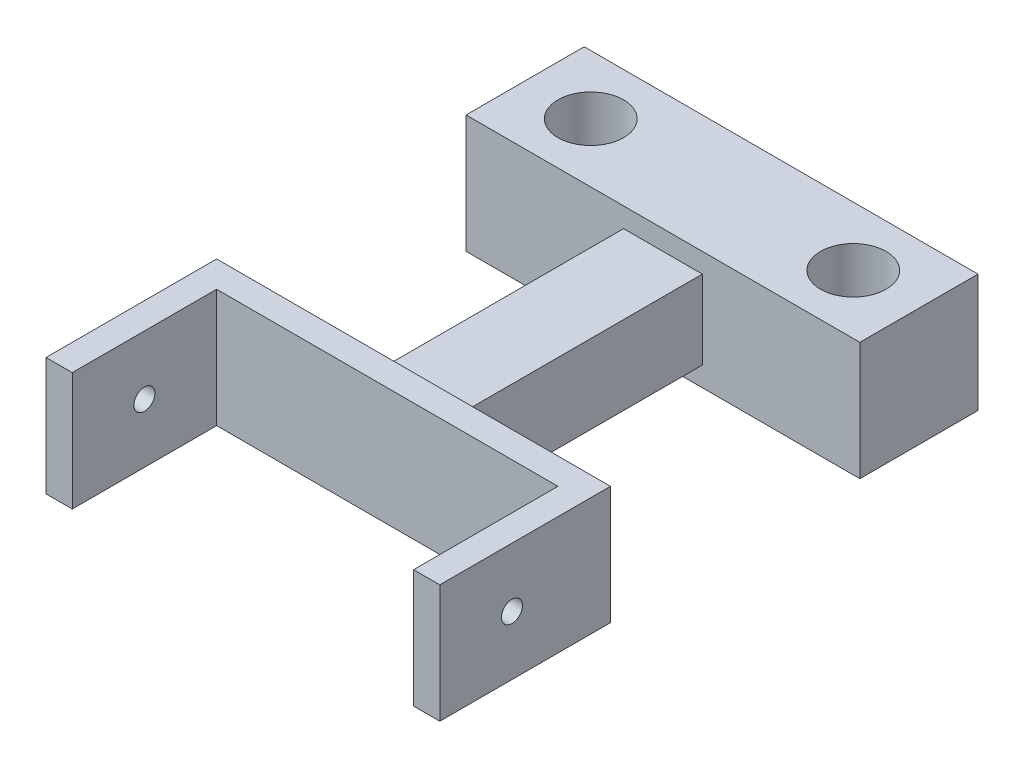
ISO-10303-21;
HEADER;
FILE_DESCRIPTION(('STEP AP214'),'2;1');
FILE_NAME('part.step','',(''),(''),'','','');
FILE_SCHEMA(('AUTOMOTIVE_DESIGN { 1 0 10303 214 1 1 1 1 }'));
ENDSEC;
DATA;
#1=APPLICATION_CONTEXT('core data for automotive mechanical design processes');
#2=APPLICATION_PROTOCOL_DEFINITION('international standard','automotive_design',2000,#1);
#3=PRODUCT_CONTEXT('',#1,'mechanical');
#4=PRODUCT('Part','Part','',(#3));
#5=PRODUCT_RELATED_PRODUCT_CATEGORY('part','',(#4));
#6=PRODUCT_DEFINITION_FORMATION('','',#4);
#7=PRODUCT_DEFINITION_CONTEXT('part definition',#1,'design');
#8=PRODUCT_DEFINITION('design','',#6,#7);
#9=PRODUCT_DEFINITION_SHAPE('','',#8);
#10=(LENGTH_UNIT() NAMED_UNIT(*) SI_UNIT(.MILLI.,.METRE.));
#11=(NAMED_UNIT(*) PLANE_ANGLE_UNIT() SI_UNIT($,.RADIAN.));
#12=(NAMED_UNIT(*) SI_UNIT($,.STERADIAN.) SOLID_ANGLE_UNIT());
#13=UNCERTAINTY_MEASURE_WITH_UNIT(LENGTH_MEASURE(1.E-05),#10,'distance_accuracy_value','');
#14=(GEOMETRIC_REPRESENTATION_CONTEXT(3) GLOBAL_UNCERTAINTY_ASSIGNED_CONTEXT((#13)) GLOBAL_UNIT_ASSIGNED_CONTEXT((#10,
#11,#12)) REPRESENTATION_CONTEXT('',''));
#15=CARTESIAN_POINT('',(0.,0.,0.));
#16=DIRECTION('',(0.,0.,1.));
#17=DIRECTION('',(1.,0.,0.));
#18=AXIS2_PLACEMENT_3D('',#15,#16,#17);
#19=CARTESIAN_POINT('',(75.,22.5,-45.));
#20=DIRECTION('',(1.,0.,0.));
#21=DIRECTION('',(0.,0.,-1.));
#22=AXIS2_PLACEMENT_3D('',#19,#20,#21);
#23=PLANE('',#22);
#24=DIRECTION('',(0.,1.,0.));
#25=VECTOR('',#24,1.);
#26=CARTESIAN_POINT('',(75.,22.5,0.));
#27=LINE('',#26,#25);
#28=CARTESIAN_POINT('',(75.,-22.5,0.));
#29=VERTEX_POINT('',#28);
#30=CARTESIAN_POINT('',(75.,22.5,0.));
#31=VERTEX_POINT('',#30);
#32=EDGE_CURVE('E221',#29,#31,#27,.T.);
#33=ORIENTED_EDGE('',*,*,#32,.F.);
#34=DIRECTION('',(0.,0.,1.));
#35=VECTOR('',#34,1.);
#36=CARTESIAN_POINT('',(75.,-22.5,-45.));
#37=LINE('',#36,#35);
#38=CARTESIAN_POINT('',(75.,-22.5,-45.));
#39=VERTEX_POINT('',#38);
#40=EDGE_CURVE('E11',#39,#29,#37,.T.);
#41=ORIENTED_EDGE('',*,*,#40,.F.);
#42=DIRECTION('',(0.,1.,0.));
#43=VECTOR('',#42,1.);
#44=CARTESIAN_POINT('',(75.,22.5,-45.));
#45=LINE('',#44,#43);
#46=CARTESIAN_POINT('',(75.,22.5,-45.));
#47=VERTEX_POINT('',#46);
#48=EDGE_CURVE('E226',#39,#47,#45,.T.);
#49=ORIENTED_EDGE('',*,*,#48,.T.);
#50=DIRECTION('',(0.,0.,1.));
#51=VECTOR('',#50,1.);
#52=CARTESIAN_POINT('',(75.,22.5,-45.));
#53=LINE('',#52,#51);
#54=EDGE_CURVE('E44',#47,#31,#53,.T.);
#55=ORIENTED_EDGE('',*,*,#54,.T.);
#56=EDGE_LOOP('',(#33,#41,#49,#55));
#57=FACE_BOUND('',#56,.T.);
#58=ADVANCED_FACE('F41',(#57),#23,.T.);
#59=CARTESIAN_POINT('',(-75.,-22.5,-45.));
#60=DIRECTION('',(0.,-1.,0.));
#61=DIRECTION('',(0.,0.,-1.));
#62=AXIS2_PLACEMENT_3D('',#59,#60,#61);
#63=PLANE('',#62);
#64=CARTESIAN_POINT('',(-50.,-22.5,-22.5));
#65=DIRECTION('',(0.,1.,0.));
#66=DIRECTION('',(0.,0.,1.));
#67=AXIS2_PLACEMENT_3D('',#64,#65,#66);
#68=CIRCLE('',#67,12.5);
#69=CARTESIAN_POINT('',(-50.,-22.5,-9.99999999999999));
#70=VERTEX_POINT('',#69);
#71=EDGE_CURVE('E217',#70,#70,#68,.T.);
#72=ORIENTED_EDGE('',*,*,#71,.T.);
#73=EDGE_LOOP('',(#72));
#74=FACE_BOUND('',#73,.T.);
#75=CARTESIAN_POINT('',(50.,-22.5,-22.5));
#76=DIRECTION('',(0.,1.,0.));
#77=DIRECTION('',(0.,0.,1.));
#78=AXIS2_PLACEMENT_3D('',#75,#76,#77);
#79=CIRCLE('',#78,12.5);
#80=CARTESIAN_POINT('',(50.,-22.5,-10.));
#81=VERTEX_POINT('',#80);
#82=EDGE_CURVE('E213',#81,#81,#79,.T.);
#83=ORIENTED_EDGE('',*,*,#82,.T.);
#84=EDGE_LOOP('',(#83));
#85=FACE_BOUND('',#84,.T.);
#86=DIRECTION('',(1.,0.,0.));
#87=VECTOR('',#86,1.);
#88=CARTESIAN_POINT('',(-75.,-22.5,0.));
#89=LINE('',#88,#87);
#90=CARTESIAN_POINT('',(-75.,-22.5,0.));
#91=VERTEX_POINT('',#90);
#92=EDGE_CURVE('E230',#91,#29,#89,.T.);
#93=ORIENTED_EDGE('',*,*,#92,.F.);
#94=DIRECTION('',(0.,0.,1.));
#95=VECTOR('',#94,1.);
#96=CARTESIAN_POINT('',(-75.,-22.5,-45.));
#97=LINE('',#96,#95);
#98=CARTESIAN_POINT('',(-75.,-22.5,-45.));
#99=VERTEX_POINT('',#98);
#100=EDGE_CURVE('E49',#99,#91,#97,.T.);
#101=ORIENTED_EDGE('',*,*,#100,.F.);
#102=DIRECTION('',(1.,0.,0.));
#103=VECTOR('',#102,1.);
#104=CARTESIAN_POINT('',(-75.,-22.5,-45.));
#105=LINE('',#104,#103);
#106=EDGE_CURVE('E236',#99,#39,#105,.T.);
#107=ORIENTED_EDGE('',*,*,#106,.T.);
#108=ORIENTED_EDGE('',*,*,#40,.T.);
#109=EDGE_LOOP('',(#93,#101,#107,#108));
#110=FACE_BOUND('',#109,.T.);
#111=ADVANCED_FACE('F262',(#74,#85,#110),#63,.T.);
#112=CARTESIAN_POINT('',(-75.,22.5,-45.));
#113=DIRECTION('',(-1.,0.,0.));
#114=DIRECTION('',(0.,0.,1.));
#115=AXIS2_PLACEMENT_3D('',#112,#113,#114);
#116=PLANE('',#115);
#117=DIRECTION('',(0.,-1.,0.));
#118=VECTOR('',#117,1.);
#119=CARTESIAN_POINT('',(-75.,22.5,0.));
#120=LINE('',#119,#118);
#121=CARTESIAN_POINT('',(-75.,22.5,0.));
#122=VERTEX_POINT('',#121);
#123=EDGE_CURVE('E244',#122,#91,#120,.T.);
#124=ORIENTED_EDGE('',*,*,#123,.F.);
#125=DIRECTION('',(0.,0.,1.));
#126=VECTOR('',#125,1.);
#127=CARTESIAN_POINT('',(-75.,22.5,-45.));
#128=LINE('',#127,#126);
#129=CARTESIAN_POINT('',(-75.,22.5,-45.));
#130=VERTEX_POINT('',#129);
#131=EDGE_CURVE('E249',#130,#122,#128,.T.);
#132=ORIENTED_EDGE('',*,*,#131,.F.);
#133=DIRECTION('',(0.,-1.,0.));
#134=VECTOR('',#133,1.);
#135=CARTESIAN_POINT('',(-75.,22.5,-45.));
#136=LINE('',#135,#134);
#137=EDGE_CURVE('E233',#130,#99,#136,.T.);
#138=ORIENTED_EDGE('',*,*,#137,.T.);
#139=ORIENTED_EDGE('',*,*,#100,.T.);
#140=EDGE_LOOP('',(#124,#132,#138,#139));
#141=FACE_BOUND('',#140,.T.);
#142=ADVANCED_FACE('F268',(#141),#116,.T.);
#143=CARTESIAN_POINT('',(-75.,22.5,-45.));
#144=DIRECTION('',(0.,1.,0.));
#145=DIRECTION('',(0.,0.,1.));
#146=AXIS2_PLACEMENT_3D('',#143,#144,#145);
#147=PLANE('',#146);
#148=CARTESIAN_POINT('',(-50.,22.5,-22.5));
#149=DIRECTION('',(0.,1.,0.));
#150=DIRECTION('',(0.,0.,1.));
#151=AXIS2_PLACEMENT_3D('',#148,#149,#150);
#152=CIRCLE('',#151,12.5);
#153=CARTESIAN_POINT('',(-50.,22.5,-9.99999999999999));
#154=VERTEX_POINT('',#153);
#155=EDGE_CURVE('E214',#154,#154,#152,.T.);
#156=ORIENTED_EDGE('',*,*,#155,.F.);
#157=EDGE_LOOP('',(#156));
#158=FACE_BOUND('',#157,.T.);
#159=CARTESIAN_POINT('',(50.,22.5,-22.5));
#160=DIRECTION('',(0.,1.,0.));
#161=DIRECTION('',(0.,0.,1.));
#162=AXIS2_PLACEMENT_3D('',#159,#160,#161);
#163=CIRCLE('',#162,12.5);
#164=CARTESIAN_POINT('',(50.,22.5,-10.));
#165=VERTEX_POINT('',#164);
#166=EDGE_CURVE('E218',#165,#165,#163,.T.);
#167=ORIENTED_EDGE('',*,*,#166,.F.);
#168=EDGE_LOOP('',(#167));
#169=FACE_BOUND('',#168,.T.);
#170=DIRECTION('',(-1.,0.,0.));
#171=VECTOR('',#170,1.);
#172=CARTESIAN_POINT('',(-75.,22.5,0.));
#173=LINE('',#172,#171);
#174=EDGE_CURVE('E241',#31,#122,#173,.T.);
#175=ORIENTED_EDGE('',*,*,#174,.F.);
#176=ORIENTED_EDGE('',*,*,#54,.F.);
#177=DIRECTION('',(-1.,0.,0.));
#178=VECTOR('',#177,1.);
#179=CARTESIAN_POINT('',(-75.,22.5,-45.));
#180=LINE('',#179,#178);
#181=EDGE_CURVE('E229',#47,#130,#180,.T.);
#182=ORIENTED_EDGE('',*,*,#181,.T.);
#183=ORIENTED_EDGE('',*,*,#131,.T.);
#184=EDGE_LOOP('',(#175,#176,#182,#183));
#185=FACE_BOUND('',#184,.T.);
#186=ADVANCED_FACE('F257',(#158,#169,#185),#147,.T.);
#187=CARTESIAN_POINT('',(0.,0.,-45.));
#188=DIRECTION('',(0.,0.,1.));
#189=DIRECTION('',(1.,0.,0.));
#190=AXIS2_PLACEMENT_3D('',#187,#188,#189);
#191=PLANE('',#190);
#192=ORIENTED_EDGE('',*,*,#48,.F.);
#193=ORIENTED_EDGE('',*,*,#106,.F.);
#194=ORIENTED_EDGE('',*,*,#137,.F.);
#195=ORIENTED_EDGE('',*,*,#181,.F.);
#196=EDGE_LOOP('',(#192,#193,#194,#195));
#197=FACE_BOUND('',#196,.T.);
#198=ADVANCED_FACE('F265',(#197),#191,.F.);
#199=CARTESIAN_POINT('',(0.,0.,0.));
#200=DIRECTION('',(0.,0.,1.));
#201=DIRECTION('',(1.,0.,0.));
#202=AXIS2_PLACEMENT_3D('',#199,#200,#201);
#203=PLANE('',#202);
#204=DIRECTION('',(0.,1.,0.));
#205=VECTOR('',#204,1.);
#206=CARTESIAN_POINT('',(15.,15.,0.));
#207=LINE('',#206,#205);
#208=CARTESIAN_POINT('',(15.,-15.,0.));
#209=VERTEX_POINT('',#208);
#210=CARTESIAN_POINT('',(15.,15.,0.));
#211=VERTEX_POINT('',#210);
#212=EDGE_CURVE('E57',#209,#211,#207,.T.);
#213=ORIENTED_EDGE('',*,*,#212,.F.);
#214=DIRECTION('',(1.,0.,0.));
#215=VECTOR('',#214,1.);
#216=CARTESIAN_POINT('',(-15.,-15.,0.));
#217=LINE('',#216,#215);
#218=CARTESIAN_POINT('',(-15.,-15.,0.));
#219=VERTEX_POINT('',#218);
#220=EDGE_CURVE('E61',#219,#209,#217,.T.);
#221=ORIENTED_EDGE('',*,*,#220,.F.);
#222=DIRECTION('',(0.,-1.,0.));
#223=VECTOR('',#222,1.);
#224=CARTESIAN_POINT('',(-15.,15.,0.));
#225=LINE('',#224,#223);
#226=CARTESIAN_POINT('',(-15.,15.,0.));
#227=VERTEX_POINT('',#226);
#228=EDGE_CURVE('E199',#227,#219,#225,.T.);
#229=ORIENTED_EDGE('',*,*,#228,.F.);
#230=DIRECTION('',(-1.,0.,0.));
#231=VECTOR('',#230,1.);
#232=CARTESIAN_POINT('',(-15.,15.,0.));
#233=LINE('',#232,#231);
#234=EDGE_CURVE('E178',#211,#227,#233,.T.);
#235=ORIENTED_EDGE('',*,*,#234,.F.);
#236=EDGE_LOOP('',(#213,#221,#229,#235));
#237=FACE_BOUND('',#236,.T.);
#238=ORIENTED_EDGE('',*,*,#32,.T.);
#239=ORIENTED_EDGE('',*,*,#174,.T.);
#240=ORIENTED_EDGE('',*,*,#123,.T.);
#241=ORIENTED_EDGE('',*,*,#92,.T.);
#242=EDGE_LOOP('',(#238,#239,#240,#241));
#243=FACE_BOUND('',#242,.T.);
#244=ADVANCED_FACE('F259',(#237,#243),#203,.T.);
#245=CARTESIAN_POINT('',(50.,-22.5,-22.5));
#246=DIRECTION('',(0.,1.,0.));
#247=DIRECTION('',(0.,0.,1.));
#248=AXIS2_PLACEMENT_3D('',#245,#246,#247);
#249=CYLINDRICAL_SURFACE('',#248,12.5);
#250=CARTESIAN_POINT('',(50.,-22.5,-10.));
#251=CARTESIAN_POINT('',(50.,-22.03125,-10.));
#252=CARTESIAN_POINT('',(50.,-21.5625,-10.));
#253=CARTESIAN_POINT('',(50.,-20.625,-10.));
#254=CARTESIAN_POINT('',(50.,-20.15625,-10.));
#255=CARTESIAN_POINT('',(50.,-19.21875,-10.));
#256=CARTESIAN_POINT('',(50.,-18.75,-10.));
#257=CARTESIAN_POINT('',(50.,-17.8125,-10.));
#258=CARTESIAN_POINT('',(50.,-17.34375,-10.));
#259=CARTESIAN_POINT('',(50.,-16.40625,-10.));
#260=CARTESIAN_POINT('',(50.,-15.9375,-10.));
#261=CARTESIAN_POINT('',(50.,-15.,-10.));
#262=CARTESIAN_POINT('',(50.,-14.53125,-10.));
#263=CARTESIAN_POINT('',(50.,-13.59375,-10.));
#264=CARTESIAN_POINT('',(50.,-13.125,-10.));
#265=CARTESIAN_POINT('',(50.,-12.1875,-10.));
#266=CARTESIAN_POINT('',(50.,-11.71875,-10.));
#267=CARTESIAN_POINT('',(50.,-10.78125,-10.));
#268=CARTESIAN_POINT('',(50.,-10.3125,-10.));
#269=CARTESIAN_POINT('',(50.,-9.375,-10.));
#270=CARTESIAN_POINT('',(50.,-8.90625,-10.));
#271=CARTESIAN_POINT('',(50.,-7.96875,-10.));
#272=CARTESIAN_POINT('',(50.,-7.5,-10.));
#273=CARTESIAN_POINT('',(50.,-6.5625,-10.));
#274=CARTESIAN_POINT('',(50.,-6.09375,-10.));
#275=CARTESIAN_POINT('',(50.,-5.15625,-10.));
#276=CARTESIAN_POINT('',(50.,-4.6875,-10.));
#277=CARTESIAN_POINT('',(50.,-3.75,-10.));
#278=CARTESIAN_POINT('',(50.,-3.28125,-10.));
#279=CARTESIAN_POINT('',(50.,-2.34375,-10.));
#280=CARTESIAN_POINT('',(50.,-1.875,-10.));
#281=CARTESIAN_POINT('',(50.,-0.937500000000001,-10.));
#282=CARTESIAN_POINT('',(50.,-0.46875,-10.));
#283=CARTESIAN_POINT('',(50.,0.46875,-10.));
#284=CARTESIAN_POINT('',(50.,0.937500000000001,-10.));
#285=CARTESIAN_POINT('',(50.,1.875,-10.));
#286=CARTESIAN_POINT('',(50.,2.34375,-10.));
#287=CARTESIAN_POINT('',(50.,3.28125,-10.));
#288=CARTESIAN_POINT('',(50.,3.75,-10.));
#289=CARTESIAN_POINT('',(50.,4.6875,-10.));
#290=CARTESIAN_POINT('',(50.,5.15625,-10.));
#291=CARTESIAN_POINT('',(50.,6.09375,-10.));
#292=CARTESIAN_POINT('',(50.,6.5625,-10.));
#293=CARTESIAN_POINT('',(50.,7.5,-10.));
#294=CARTESIAN_POINT('',(50.,7.96875,-10.));
#295=CARTESIAN_POINT('',(50.,8.90625,-10.));
#296=CARTESIAN_POINT('',(50.,9.375,-10.));
#297=CARTESIAN_POINT('',(50.,10.3125,-10.));
#298=CARTESIAN_POINT('',(50.,10.78125,-10.));
#299=CARTESIAN_POINT('',(50.,11.71875,-10.));
#300=CARTESIAN_POINT('',(50.,12.1875,-10.));
#301=CARTESIAN_POINT('',(50.,13.125,-10.));
#302=CARTESIAN_POINT('',(50.,13.59375,-10.));
#303=CARTESIAN_POINT('',(50.,14.53125,-10.));
#304=CARTESIAN_POINT('',(50.,15.,-10.));
#305=CARTESIAN_POINT('',(50.,15.9375,-10.));
#306=CARTESIAN_POINT('',(50.,16.40625,-10.));
#307=CARTESIAN_POINT('',(50.,17.34375,-10.));
#308=CARTESIAN_POINT('',(50.,17.8125,-10.));
#309=CARTESIAN_POINT('',(50.,18.75,-10.));
#310=CARTESIAN_POINT('',(50.,19.21875,-10.));
#311=CARTESIAN_POINT('',(50.,20.15625,-10.));
#312=CARTESIAN_POINT('',(50.,20.625,-10.));
#313=CARTESIAN_POINT('',(50.,21.5625,-10.));
#314=CARTESIAN_POINT('',(50.,22.03125,-10.));
#315=CARTESIAN_POINT('',(50.,22.5,-10.));
#316=B_SPLINE_CURVE_WITH_KNOTS('',3,(#250,#251,#252,#253,#254,#255,#256,#257,#258,#259,#260,
#261,#262,#263,#264,#265,#266,#267,#268,#269,#270,#271,#272,#273,#274,#275,#276,#277,#278,#279,
#280,#281,#282,#283,#284,#285,#286,#287,#288,#289,#290,#291,#292,#293,#294,#295,#296,#297,#298,
#299,#300,#301,#302,#303,#304,#305,#306,#307,#308,#309,#310,#311,#312,#313,#314,#315),
.UNSPECIFIED.,.F.,.F.,(4,2,2,2,2,2,2,2,2,2,2,2,2,2,2,2,2,2,2,2,2,2,2,2,2,2,2,2,2,2,2,2,4),(0.,
1.40625,2.8125,4.21875,5.625,7.03125,8.4375,9.84375,11.25,12.65625,14.0625,15.46875,16.875,
18.28125,19.6875,21.09375,22.5,23.90625,25.3125,26.71875,28.125,29.53125,30.9375,32.34375,33.75,
35.15625,36.5625,37.96875,39.375,40.78125,42.1875,43.59375,45.),.UNSPECIFIED.);
#317=EDGE_CURVE('BSEAM316',#81,#165,#316,.T.);
#318=ORIENTED_EDGE('',*,*,#82,.F.);
#319=ORIENTED_EDGE('',*,*,#166,.T.);
#320=ORIENTED_EDGE('',*,*,#317,.T.);
#321=ORIENTED_EDGE('',*,*,#317,.F.);
#322=EDGE_LOOP('',(#318,#320,#319,#321));
#323=FACE_BOUND('',#322,.T.);
#324=ADVANCED_FACE('F316',(#323),#249,.F.);
#325=CARTESIAN_POINT('',(-50.,-22.5,-22.5));
#326=DIRECTION('',(0.,1.,0.));
#327=DIRECTION('',(0.,0.,1.));
#328=AXIS2_PLACEMENT_3D('',#325,#326,#327);
#329=CYLINDRICAL_SURFACE('',#328,12.5);
#330=CARTESIAN_POINT('',(-50.,-22.5,-9.99999999999999));
#331=CARTESIAN_POINT('',(-50.,-22.03125,-9.99999999999999));
#332=CARTESIAN_POINT('',(-50.,-21.5625,-9.99999999999999));
#333=CARTESIAN_POINT('',(-50.,-20.625,-9.99999999999999));
#334=CARTESIAN_POINT('',(-50.,-20.15625,-9.99999999999999));
#335=CARTESIAN_POINT('',(-50.,-19.21875,-9.99999999999999));
#336=CARTESIAN_POINT('',(-50.,-18.75,-9.99999999999999));
#337=CARTESIAN_POINT('',(-50.,-17.8125,-9.99999999999999));
#338=CARTESIAN_POINT('',(-50.,-17.34375,-9.99999999999999));
#339=CARTESIAN_POINT('',(-50.,-16.40625,-9.99999999999999));
#340=CARTESIAN_POINT('',(-50.,-15.9375,-9.99999999999999));
#341=CARTESIAN_POINT('',(-50.,-15.,-9.99999999999999));
#342=CARTESIAN_POINT('',(-50.,-14.53125,-9.99999999999999));
#343=CARTESIAN_POINT('',(-50.,-13.59375,-9.99999999999999));
#344=CARTESIAN_POINT('',(-50.,-13.125,-9.99999999999999));
#345=CARTESIAN_POINT('',(-50.,-12.1875,-9.99999999999999));
#346=CARTESIAN_POINT('',(-50.,-11.71875,-9.99999999999999));
#347=CARTESIAN_POINT('',(-50.,-10.78125,-9.99999999999999));
#348=CARTESIAN_POINT('',(-50.,-10.3125,-9.99999999999999));
#349=CARTESIAN_POINT('',(-50.,-9.375,-9.99999999999999));
#350=CARTESIAN_POINT('',(-50.,-8.90625,-9.99999999999999));
#351=CARTESIAN_POINT('',(-50.,-7.96875,-9.99999999999999));
#352=CARTESIAN_POINT('',(-50.,-7.5,-9.99999999999999));
#353=CARTESIAN_POINT('',(-50.,-6.5625,-9.99999999999999));
#354=CARTESIAN_POINT('',(-50.,-6.09375,-9.99999999999999));
#355=CARTESIAN_POINT('',(-50.,-5.15625,-9.99999999999999));
#356=CARTESIAN_POINT('',(-50.,-4.6875,-9.99999999999999));
#357=CARTESIAN_POINT('',(-50.,-3.75,-9.99999999999999));
#358=CARTESIAN_POINT('',(-50.,-3.28125,-9.99999999999999));
#359=CARTESIAN_POINT('',(-50.,-2.34375,-9.99999999999999));
#360=CARTESIAN_POINT('',(-50.,-1.875,-9.99999999999999));
#361=CARTESIAN_POINT('',(-50.,-0.937500000000001,-9.99999999999999));
#362=CARTESIAN_POINT('',(-50.,-0.46875,-9.99999999999999));
#363=CARTESIAN_POINT('',(-50.,0.46875,-9.99999999999999));
#364=CARTESIAN_POINT('',(-50.,0.937500000000001,-9.99999999999999));
#365=CARTESIAN_POINT('',(-50.,1.875,-9.99999999999999));
#366=CARTESIAN_POINT('',(-50.,2.34375,-9.99999999999999));
#367=CARTESIAN_POINT('',(-50.,3.28125,-9.99999999999999));
#368=CARTESIAN_POINT('',(-50.,3.75,-9.99999999999999));
#369=CARTESIAN_POINT('',(-50.,4.6875,-9.99999999999999));
#370=CARTESIAN_POINT('',(-50.,5.15625,-9.99999999999999));
#371=CARTESIAN_POINT('',(-50.,6.09375,-9.99999999999999));
#372=CARTESIAN_POINT('',(-50.,6.5625,-9.99999999999999));
#373=CARTESIAN_POINT('',(-50.,7.5,-9.99999999999999));
#374=CARTESIAN_POINT('',(-50.,7.96875,-9.99999999999999));
#375=CARTESIAN_POINT('',(-50.,8.90625,-9.99999999999999));
#376=CARTESIAN_POINT('',(-50.,9.375,-9.99999999999999));
#377=CARTESIAN_POINT('',(-50.,10.3125,-9.99999999999999));
#378=CARTESIAN_POINT('',(-50.,10.78125,-9.99999999999999));
#379=CARTESIAN_POINT('',(-50.,11.71875,-9.99999999999999));
#380=CARTESIAN_POINT('',(-50.,12.1875,-9.99999999999999));
#381=CARTESIAN_POINT('',(-50.,13.125,-9.99999999999999));
#382=CARTESIAN_POINT('',(-50.,13.59375,-9.99999999999999));
#383=CARTESIAN_POINT('',(-50.,14.53125,-9.99999999999999));
#384=CARTESIAN_POINT('',(-50.,15.,-9.99999999999999));
#385=CARTESIAN_POINT('',(-50.,15.9375,-9.99999999999999));
#386=CARTESIAN_POINT('',(-50.,16.40625,-9.99999999999999));
#387=CARTESIAN_POINT('',(-50.,17.34375,-9.99999999999999));
#388=CARTESIAN_POINT('',(-50.,17.8125,-9.99999999999999));
#389=CARTESIAN_POINT('',(-50.,18.75,-9.99999999999999));
#390=CARTESIAN_POINT('',(-50.,19.21875,-9.99999999999999));
#391=CARTESIAN_POINT('',(-50.,20.15625,-9.99999999999999));
#392=CARTESIAN_POINT('',(-50.,20.625,-9.99999999999999));
#393=CARTESIAN_POINT('',(-50.,21.5625,-9.99999999999999));
#394=CARTESIAN_POINT('',(-50.,22.03125,-9.99999999999999));
#395=CARTESIAN_POINT('',(-50.,22.5,-9.99999999999999));
#396=B_SPLINE_CURVE_WITH_KNOTS('',3,(#330,#331,#332,#333,#334,#335,#336,#337,#338,#339,#340,
#341,#342,#343,#344,#345,#346,#347,#348,#349,#350,#351,#352,#353,#354,#355,#356,#357,#358,#359,
#360,#361,#362,#363,#364,#365,#366,#367,#368,#369,#370,#371,#372,#373,#374,#375,#376,#377,#378,
#379,#380,#381,#382,#383,#384,#385,#386,#387,#388,#389,#390,#391,#392,#393,#394,#395),
.UNSPECIFIED.,.F.,.F.,(4,2,2,2,2,2,2,2,2,2,2,2,2,2,2,2,2,2,2,2,2,2,2,2,2,2,2,2,2,2,2,2,4),(0.,
1.40625,2.8125,4.21875,5.625,7.03125,8.4375,9.84375,11.25,12.65625,14.0625,15.46875,16.875,
18.28125,19.6875,21.09375,22.5,23.90625,25.3125,26.71875,28.125,29.53125,30.9375,32.34375,33.75,
35.15625,36.5625,37.96875,39.375,40.78125,42.1875,43.59375,45.),.UNSPECIFIED.);
#397=EDGE_CURVE('BSEAM326',#70,#154,#396,.T.);
#398=ORIENTED_EDGE('',*,*,#71,.F.);
#399=ORIENTED_EDGE('',*,*,#155,.T.);
#400=ORIENTED_EDGE('',*,*,#397,.T.);
#401=ORIENTED_EDGE('',*,*,#397,.F.);
#402=EDGE_LOOP('',(#398,#400,#399,#401));
#403=FACE_BOUND('',#402,.T.);
#404=ADVANCED_FACE('F326',(#403),#329,.F.);
#405=CARTESIAN_POINT('',(15.,15.,95.));
#406=DIRECTION('',(-1.,0.,0.));
#407=DIRECTION('',(0.,-1.,0.));
#408=AXIS2_PLACEMENT_3D('',#405,#406,#407);
#409=PLANE('',#408);
#410=ORIENTED_EDGE('',*,*,#212,.T.);
#411=DIRECTION('',(0.,0.,-1.));
#412=VECTOR('',#411,1.);
#413=CARTESIAN_POINT('',(15.,15.,95.));
#414=LINE('',#413,#412);
#415=CARTESIAN_POINT('',(15.,15.,95.));
#416=VERTEX_POINT('',#415);
#417=EDGE_CURVE('E210',#416,#211,#414,.T.);
#418=ORIENTED_EDGE('',*,*,#417,.F.);
#419=DIRECTION('',(0.,1.,0.));
#420=VECTOR('',#419,1.);
#421=CARTESIAN_POINT('',(15.,15.,95.));
#422=LINE('',#421,#420);
#423=CARTESIAN_POINT('',(15.,-15.,95.));
#424=VERTEX_POINT('',#423);
#425=EDGE_CURVE('E184',#424,#416,#422,.T.);
#426=ORIENTED_EDGE('',*,*,#425,.F.);
#427=DIRECTION('',(0.,0.,-1.));
#428=VECTOR('',#427,1.);
#429=CARTESIAN_POINT('',(15.,-15.,95.));
#430=LINE('',#429,#428);
#431=EDGE_CURVE('E195',#424,#209,#430,.T.);
#432=ORIENTED_EDGE('',*,*,#431,.T.);
#433=EDGE_LOOP('',(#410,#418,#426,#432));
#434=FACE_BOUND('',#433,.T.);
#435=ADVANCED_FACE('F335',(#434),#409,.F.);
#436=CARTESIAN_POINT('',(-15.,15.,95.));
#437=DIRECTION('',(0.,-1.,0.));
#438=DIRECTION('',(0.,0.,-1.));
#439=AXIS2_PLACEMENT_3D('',#436,#437,#438);
#440=PLANE('',#439);
#441=ORIENTED_EDGE('',*,*,#234,.T.);
#442=DIRECTION('',(0.,0.,-1.));
#443=VECTOR('',#442,1.);
#444=CARTESIAN_POINT('',(-15.,15.,95.));
#445=LINE('',#444,#443);
#446=CARTESIAN_POINT('',(-15.,15.,95.));
#447=VERTEX_POINT('',#446);
#448=EDGE_CURVE('E207',#447,#227,#445,.T.);
#449=ORIENTED_EDGE('',*,*,#448,.F.);
#450=DIRECTION('',(-1.,0.,0.));
#451=VECTOR('',#450,1.);
#452=CARTESIAN_POINT('',(-15.,15.,95.));
#453=LINE('',#452,#451);
#454=EDGE_CURVE('E187',#416,#447,#453,.T.);
#455=ORIENTED_EDGE('',*,*,#454,.F.);
#456=ORIENTED_EDGE('',*,*,#417,.T.);
#457=EDGE_LOOP('',(#441,#449,#455,#456));
#458=FACE_BOUND('',#457,.T.);
#459=ADVANCED_FACE('F344',(#458),#440,.F.);
#460=CARTESIAN_POINT('',(-15.,15.,95.));
#461=DIRECTION('',(1.,0.,0.));
#462=DIRECTION('',(0.,1.,0.));
#463=AXIS2_PLACEMENT_3D('',#460,#461,#462);
#464=PLANE('',#463);
#465=ORIENTED_EDGE('',*,*,#228,.T.);
#466=DIRECTION('',(0.,0.,-1.));
#467=VECTOR('',#466,1.);
#468=CARTESIAN_POINT('',(-15.,-15.,95.));
#469=LINE('',#468,#467);
#470=CARTESIAN_POINT('',(-15.,-15.,95.));
#471=VERTEX_POINT('',#470);
#472=EDGE_CURVE('E204',#471,#219,#469,.T.);
#473=ORIENTED_EDGE('',*,*,#472,.F.);
#474=DIRECTION('',(0.,-1.,0.));
#475=VECTOR('',#474,1.);
#476=CARTESIAN_POINT('',(-15.,15.,95.));
#477=LINE('',#476,#475);
#478=EDGE_CURVE('E190',#447,#471,#477,.T.);
#479=ORIENTED_EDGE('',*,*,#478,.F.);
#480=ORIENTED_EDGE('',*,*,#448,.T.);
#481=EDGE_LOOP('',(#465,#473,#479,#480));
#482=FACE_BOUND('',#481,.T.);
#483=ADVANCED_FACE('F354',(#482),#464,.F.);
#484=CARTESIAN_POINT('',(-15.,-15.,95.));
#485=DIRECTION('',(0.,1.,0.));
#486=DIRECTION('',(0.,0.,1.));
#487=AXIS2_PLACEMENT_3D('',#484,#485,#486);
#488=PLANE('',#487);
#489=ORIENTED_EDGE('',*,*,#220,.T.);
#490=ORIENTED_EDGE('',*,*,#431,.F.);
#491=DIRECTION('',(1.,0.,0.));
#492=VECTOR('',#491,1.);
#493=CARTESIAN_POINT('',(-15.,-15.,95.));
#494=LINE('',#493,#492);
#495=EDGE_CURVE('E193',#471,#424,#494,.T.);
#496=ORIENTED_EDGE('',*,*,#495,.F.);
#497=ORIENTED_EDGE('',*,*,#472,.T.);
#498=EDGE_LOOP('',(#489,#490,#496,#497));
#499=FACE_BOUND('',#498,.T.);
#500=ADVANCED_FACE('F364',(#499),#488,.F.);
#501=CARTESIAN_POINT('',(-75.,22.5,95.));
#502=DIRECTION('',(0.,0.,1.));
#503=DIRECTION('',(1.,0.,0.));
#504=AXIS2_PLACEMENT_3D('',#501,#502,#503);
#505=PLANE('',#504);
#506=DIRECTION('',(-1.,0.,0.));
#507=VECTOR('',#506,1.);
#508=CARTESIAN_POINT('',(-75.,-22.5,95.));
#509=LINE('',#508,#507);
#510=CARTESIAN_POINT('',(75.,-22.5,95.));
#511=VERTEX_POINT('',#510);
#512=CARTESIAN_POINT('',(-75.,-22.5,95.));
#513=VERTEX_POINT('',#512);
#514=EDGE_CURVE('E172',#511,#513,#509,.T.);
#515=ORIENTED_EDGE('',*,*,#514,.T.);
#516=DIRECTION('',(0.,-1.,0.));
#517=VECTOR('',#516,1.);
#518=CARTESIAN_POINT('',(-75.,22.5,95.));
#519=LINE('',#518,#517);
#520=CARTESIAN_POINT('',(-75.,22.5,95.));
#521=VERTEX_POINT('',#520);
#522=EDGE_CURVE('E515',#521,#513,#519,.T.);
#523=ORIENTED_EDGE('',*,*,#522,.F.);
#524=DIRECTION('',(-1.,0.,0.));
#525=VECTOR('',#524,1.);
#526=CARTESIAN_POINT('',(-75.,22.5,95.));
#527=LINE('',#526,#525);
#528=CARTESIAN_POINT('',(75.,22.5,95.));
#529=VERTEX_POINT('',#528);
#530=EDGE_CURVE('E168',#529,#521,#527,.T.);
#531=ORIENTED_EDGE('',*,*,#530,.F.);
#532=DIRECTION('',(0.,-1.,0.));
#533=VECTOR('',#532,1.);
#534=CARTESIAN_POINT('',(75.,22.5,95.));
#535=LINE('',#534,#533);
#536=EDGE_CURVE('E530',#529,#511,#535,.T.);
#537=ORIENTED_EDGE('',*,*,#536,.T.);
#538=EDGE_LOOP('',(#515,#523,#531,#537));
#539=FACE_BOUND('',#538,.T.);
#540=ORIENTED_EDGE('',*,*,#495,.T.);
#541=ORIENTED_EDGE('',*,*,#425,.T.);
#542=ORIENTED_EDGE('',*,*,#454,.T.);
#543=ORIENTED_EDGE('',*,*,#478,.T.);
#544=EDGE_LOOP('',(#540,#541,#542,#543));
#545=FACE_BOUND('',#544,.T.);
#546=ADVANCED_FACE('F374',(#539,#545),#505,.F.);
#547=CARTESIAN_POINT('',(-75.,22.5,160.));
#548=DIRECTION('',(1.,0.,0.));
#549=DIRECTION('',(0.,0.,-1.));
#550=AXIS2_PLACEMENT_3D('',#547,#548,#549);
#551=PLANE('',#550);
#552=CARTESIAN_POINT('',(-75.,0.,132.5));
#553=DIRECTION('',(1.,0.,0.));
#554=DIRECTION('',(0.,0.,-1.));
#555=AXIS2_PLACEMENT_3D('',#552,#553,#554);
#556=CIRCLE('',#555,3.99999999999999);
#557=CARTESIAN_POINT('',(-75.,0.,128.5));
#558=VERTEX_POINT('',#557);
#559=EDGE_CURVE('E494',#558,#558,#556,.T.);
#560=ORIENTED_EDGE('',*,*,#559,.T.);
#561=EDGE_LOOP('',(#560));
#562=FACE_BOUND('',#561,.T.);
#563=DIRECTION('',(0.,0.,1.));
#564=VECTOR('',#563,1.);
#565=CARTESIAN_POINT('',(-75.,-22.5,160.));
#566=LINE('',#565,#564);
#567=CARTESIAN_POINT('',(-75.,-22.5,160.));
#568=VERTEX_POINT('',#567);
#569=EDGE_CURVE('E176',#513,#568,#566,.T.);
#570=ORIENTED_EDGE('',*,*,#569,.T.);
#571=DIRECTION('',(0.,-1.,0.));
#572=VECTOR('',#571,1.);
#573=CARTESIAN_POINT('',(-75.,22.5,160.));
#574=LINE('',#573,#572);
#575=CARTESIAN_POINT('',(-75.,22.5,160.));
#576=VERTEX_POINT('',#575);
#577=EDGE_CURVE('E156',#576,#568,#574,.T.);
#578=ORIENTED_EDGE('',*,*,#577,.F.);
#579=DIRECTION('',(0.,0.,1.));
#580=VECTOR('',#579,1.);
#581=CARTESIAN_POINT('',(-75.,22.5,160.));
#582=LINE('',#581,#580);
#583=EDGE_CURVE('E163',#521,#576,#582,.T.);
#584=ORIENTED_EDGE('',*,*,#583,.F.);
#585=ORIENTED_EDGE('',*,*,#522,.T.);
#586=EDGE_LOOP('',(#570,#578,#584,#585));
#587=FACE_BOUND('',#586,.T.);
#588=ADVANCED_FACE('F174',(#562,#587),#551,.F.);
#589=CARTESIAN_POINT('',(-65.,22.5,160.));
#590=DIRECTION('',(0.,0.,-1.));
#591=DIRECTION('',(-1.,0.,0.));
#592=AXIS2_PLACEMENT_3D('',#589,#590,#591);
#593=PLANE('',#592);
#594=DIRECTION('',(1.,0.,0.));
#595=VECTOR('',#594,1.);
#596=CARTESIAN_POINT('',(-65.,-22.5,160.));
#597=LINE('',#596,#595);
#598=CARTESIAN_POINT('',(-65.,-22.5,160.));
#599=VERTEX_POINT('',#598);
#600=EDGE_CURVE('E500',#568,#599,#597,.T.);
#601=ORIENTED_EDGE('',*,*,#600,.T.);
#602=DIRECTION('',(0.,-1.,0.));
#603=VECTOR('',#602,1.);
#604=CARTESIAN_POINT('',(-65.,22.5,160.));
#605=LINE('',#604,#603);
#606=CARTESIAN_POINT('',(-65.,22.5,160.));
#607=VERTEX_POINT('',#606);
#608=EDGE_CURVE('E159',#607,#599,#605,.T.);
#609=ORIENTED_EDGE('',*,*,#608,.F.);
#610=DIRECTION('',(1.,0.,0.));
#611=VECTOR('',#610,1.);
#612=CARTESIAN_POINT('',(-65.,22.5,160.));
#613=LINE('',#612,#611);
#614=EDGE_CURVE('E152',#576,#607,#613,.T.);
#615=ORIENTED_EDGE('',*,*,#614,.F.);
#616=ORIENTED_EDGE('',*,*,#577,.T.);
#617=EDGE_LOOP('',(#601,#609,#615,#616));
#618=FACE_BOUND('',#617,.T.);
#619=ADVANCED_FACE('F154',(#618),#593,.F.);
#620=CARTESIAN_POINT('',(-65.,22.5,105.));
#621=DIRECTION('',(-1.,0.,0.));
#622=DIRECTION('',(0.,0.,1.));
#623=AXIS2_PLACEMENT_3D('',#620,#621,#622);
#624=PLANE('',#623);
#625=CARTESIAN_POINT('',(-65.,0.,132.5));
#626=DIRECTION('',(-1.,0.,0.));
#627=DIRECTION('',(0.,0.,1.));
#628=AXIS2_PLACEMENT_3D('',#625,#626,#627);
#629=CIRCLE('',#628,3.99999999999999);
#630=CARTESIAN_POINT('',(-65.,0.,136.5));
#631=VERTEX_POINT('',#630);
#632=EDGE_CURVE('E497',#631,#631,#629,.T.);
#633=ORIENTED_EDGE('',*,*,#632,.T.);
#634=EDGE_LOOP('',(#633));
#635=FACE_BOUND('',#634,.T.);
#636=DIRECTION('',(0.,0.,-1.));
#637=VECTOR('',#636,1.);
#638=CARTESIAN_POINT('',(-65.,-22.5,105.));
#639=LINE('',#638,#637);
#640=CARTESIAN_POINT('',(-65.,-22.5,105.));
#641=VERTEX_POINT('',#640);
#642=EDGE_CURVE('E518',#599,#641,#639,.T.);
#643=ORIENTED_EDGE('',*,*,#642,.T.);
#644=DIRECTION('',(0.,-1.,0.));
#645=VECTOR('',#644,1.);
#646=CARTESIAN_POINT('',(-65.,22.5,105.));
#647=LINE('',#646,#645);
#648=CARTESIAN_POINT('',(-65.,22.5,105.));
#649=VERTEX_POINT('',#648);
#650=EDGE_CURVE('E180',#649,#641,#647,.T.);
#651=ORIENTED_EDGE('',*,*,#650,.F.);
#652=DIRECTION('',(0.,0.,-1.));
#653=VECTOR('',#652,1.);
#654=CARTESIAN_POINT('',(-65.,22.5,105.));
#655=LINE('',#654,#653);
#656=EDGE_CURVE('E162',#607,#649,#655,.T.);
#657=ORIENTED_EDGE('',*,*,#656,.F.);
#658=ORIENTED_EDGE('',*,*,#608,.T.);
#659=EDGE_LOOP('',(#643,#651,#657,#658));
#660=FACE_BOUND('',#659,.T.);
#661=ADVANCED_FACE('F404',(#635,#660),#624,.F.);
#662=CARTESIAN_POINT('',(65.0000000000001,22.5,105.));
#663=DIRECTION('',(0.,0.,-1.));
#664=DIRECTION('',(-1.,0.,0.));
#665=AXIS2_PLACEMENT_3D('',#662,#663,#664);
#666=PLANE('',#665);
#667=DIRECTION('',(1.,0.,0.));
#668=VECTOR('',#667,1.);
#669=CARTESIAN_POINT('',(65.0000000000001,-22.5,105.));
#670=LINE('',#669,#668);
#671=CARTESIAN_POINT('',(65.0000000000001,-22.5,105.));
#672=VERTEX_POINT('',#671);
#673=EDGE_CURVE('E520',#641,#672,#670,.T.);
#674=ORIENTED_EDGE('',*,*,#673,.T.);
#675=DIRECTION('',(0.,-1.,0.));
#676=VECTOR('',#675,1.);
#677=CARTESIAN_POINT('',(65.0000000000001,22.5,105.));
#678=LINE('',#677,#676);
#679=CARTESIAN_POINT('',(65.0000000000001,22.5,105.));
#680=VERTEX_POINT('',#679);
#681=EDGE_CURVE('E539',#680,#672,#678,.T.);
#682=ORIENTED_EDGE('',*,*,#681,.F.);
#683=DIRECTION('',(1.,0.,0.));
#684=VECTOR('',#683,1.);
#685=CARTESIAN_POINT('',(65.0000000000001,22.5,105.));
#686=LINE('',#685,#684);
#687=EDGE_CURVE('E507',#649,#680,#686,.T.);
#688=ORIENTED_EDGE('',*,*,#687,.F.);
#689=ORIENTED_EDGE('',*,*,#650,.T.);
#690=EDGE_LOOP('',(#674,#682,#688,#689));
#691=FACE_BOUND('',#690,.T.);
#692=ADVANCED_FACE('F413',(#691),#666,.F.);
#693=CARTESIAN_POINT('',(65.0000000000001,22.5,160.));
#694=DIRECTION('',(1.,0.,0.));
#695=DIRECTION('',(0.,0.,-1.));
#696=AXIS2_PLACEMENT_3D('',#693,#694,#695);
#697=PLANE('',#696);
#698=CARTESIAN_POINT('',(65.,0.,132.5));
#699=DIRECTION('',(1.,0.,0.));
#700=DIRECTION('',(0.,0.,-1.));
#701=AXIS2_PLACEMENT_3D('',#698,#699,#700);
#702=CIRCLE('',#701,3.99999999999999);
#703=CARTESIAN_POINT('',(65.,0.,128.5));
#704=VERTEX_POINT('',#703);
#705=EDGE_CURVE('E498',#704,#704,#702,.T.);
#706=ORIENTED_EDGE('',*,*,#705,.T.);
#707=EDGE_LOOP('',(#706));
#708=FACE_BOUND('',#707,.T.);
#709=DIRECTION('',(0.,0.,1.));
#710=VECTOR('',#709,1.);
#711=CARTESIAN_POINT('',(65.0000000000001,-22.5,160.));
#712=LINE('',#711,#710);
#713=CARTESIAN_POINT('',(65.0000000000001,-22.5,160.));
#714=VERTEX_POINT('',#713);
#715=EDGE_CURVE('E522',#672,#714,#712,.T.);
#716=ORIENTED_EDGE('',*,*,#715,.T.);
#717=DIRECTION('',(0.,-1.,0.));
#718=VECTOR('',#717,1.);
#719=CARTESIAN_POINT('',(65.0000000000001,22.5,160.));
#720=LINE('',#719,#718);
#721=CARTESIAN_POINT('',(65.0000000000001,22.5,160.));
#722=VERTEX_POINT('',#721);
#723=EDGE_CURVE('E536',#722,#714,#720,.T.);
#724=ORIENTED_EDGE('',*,*,#723,.F.);
#725=DIRECTION('',(0.,0.,1.));
#726=VECTOR('',#725,1.);
#727=CARTESIAN_POINT('',(65.0000000000001,22.5,160.));
#728=LINE('',#727,#726);
#729=EDGE_CURVE('E509',#680,#722,#728,.T.);
#730=ORIENTED_EDGE('',*,*,#729,.F.);
#731=ORIENTED_EDGE('',*,*,#681,.T.);
#732=EDGE_LOOP('',(#716,#724,#730,#731));
#733=FACE_BOUND('',#732,.T.);
#734=ADVANCED_FACE('F423',(#708,#733),#697,.F.);
#735=CARTESIAN_POINT('',(75.0000000000001,22.5,160.));
#736=DIRECTION('',(0.,0.,-1.));
#737=DIRECTION('',(-1.,0.,0.));
#738=AXIS2_PLACEMENT_3D('',#735,#736,#737);
#739=PLANE('',#738);
#740=DIRECTION('',(1.,0.,0.));
#741=VECTOR('',#740,1.);
#742=CARTESIAN_POINT('',(75.0000000000001,-22.5,160.));
#743=LINE('',#742,#741);
#744=CARTESIAN_POINT('',(75.0000000000001,-22.5,160.));
#745=VERTEX_POINT('',#744);
#746=EDGE_CURVE('E524',#714,#745,#743,.T.);
#747=ORIENTED_EDGE('',*,*,#746,.T.);
#748=DIRECTION('',(0.,-1.,0.));
#749=VECTOR('',#748,1.);
#750=CARTESIAN_POINT('',(75.0000000000001,22.5,160.));
#751=LINE('',#750,#749);
#752=CARTESIAN_POINT('',(75.0000000000001,22.5,160.));
#753=VERTEX_POINT('',#752);
#754=EDGE_CURVE('E533',#753,#745,#751,.T.);
#755=ORIENTED_EDGE('',*,*,#754,.F.);
#756=DIRECTION('',(1.,0.,0.));
#757=VECTOR('',#756,1.);
#758=CARTESIAN_POINT('',(75.0000000000001,22.5,160.));
#759=LINE('',#758,#757);
#760=EDGE_CURVE('E511',#722,#753,#759,.T.);
#761=ORIENTED_EDGE('',*,*,#760,.F.);
#762=ORIENTED_EDGE('',*,*,#723,.T.);
#763=EDGE_LOOP('',(#747,#755,#761,#762));
#764=FACE_BOUND('',#763,.T.);
#765=ADVANCED_FACE('F433',(#764),#739,.F.);
#766=CARTESIAN_POINT('',(75.,22.5,95.));
#767=DIRECTION('',(-1.,0.,0.));
#768=DIRECTION('',(0.,0.,1.));
#769=AXIS2_PLACEMENT_3D('',#766,#767,#768);
#770=PLANE('',#769);
#771=CARTESIAN_POINT('',(75.0000000000001,0.,132.5));
#772=DIRECTION('',(1.,0.,0.));
#773=DIRECTION('',(0.,0.,-1.));
#774=AXIS2_PLACEMENT_3D('',#771,#772,#773);
#775=CIRCLE('',#774,3.99999999999999);
#776=CARTESIAN_POINT('',(75.0000000000001,0.,128.5));
#777=VERTEX_POINT('',#776);
#778=EDGE_CURVE('E566',#777,#777,#775,.T.);
#779=ORIENTED_EDGE('',*,*,#778,.F.);
#780=EDGE_LOOP('',(#779));
#781=FACE_BOUND('',#780,.T.);
#782=DIRECTION('',(0.,0.,-1.));
#783=VECTOR('',#782,1.);
#784=CARTESIAN_POINT('',(75.,-22.5,95.));
#785=LINE('',#784,#783);
#786=EDGE_CURVE('E526',#745,#511,#785,.T.);
#787=ORIENTED_EDGE('',*,*,#786,.T.);
#788=ORIENTED_EDGE('',*,*,#536,.F.);
#789=DIRECTION('',(0.,0.,-1.));
#790=VECTOR('',#789,1.);
#791=CARTESIAN_POINT('',(75.,22.5,95.));
#792=LINE('',#791,#790);
#793=EDGE_CURVE('E513',#753,#529,#792,.T.);
#794=ORIENTED_EDGE('',*,*,#793,.F.);
#795=ORIENTED_EDGE('',*,*,#754,.T.);
#796=EDGE_LOOP('',(#787,#788,#794,#795));
#797=FACE_BOUND('',#796,.T.);
#798=ADVANCED_FACE('F443',(#781,#797),#770,.F.);
#799=CARTESIAN_POINT('',(0.,22.5,0.));
#800=DIRECTION('',(0.,-1.,0.));
#801=DIRECTION('',(0.,0.,-1.));
#802=AXIS2_PLACEMENT_3D('',#799,#800,#801);
#803=PLANE('',#802);
#804=ORIENTED_EDGE('',*,*,#583,.T.);
#805=ORIENTED_EDGE('',*,*,#614,.T.);
#806=ORIENTED_EDGE('',*,*,#656,.T.);
#807=ORIENTED_EDGE('',*,*,#687,.T.);
#808=ORIENTED_EDGE('',*,*,#729,.T.);
#809=ORIENTED_EDGE('',*,*,#760,.T.);
#810=ORIENTED_EDGE('',*,*,#793,.T.);
#811=ORIENTED_EDGE('',*,*,#530,.T.);
#812=EDGE_LOOP('',(#804,#805,#806,#807,#808,#809,#810,#811));
#813=FACE_BOUND('',#812,.T.);
#814=ADVANCED_FACE('F166',(#813),#803,.F.);
#815=CARTESIAN_POINT('',(0.,-22.5,0.));
#816=DIRECTION('',(0.,-1.,0.));
#817=DIRECTION('',(0.,0.,-1.));
#818=AXIS2_PLACEMENT_3D('',#815,#816,#817);
#819=PLANE('',#818);
#820=ORIENTED_EDGE('',*,*,#569,.F.);
#821=ORIENTED_EDGE('',*,*,#514,.F.);
#822=ORIENTED_EDGE('',*,*,#786,.F.);
#823=ORIENTED_EDGE('',*,*,#746,.F.);
#824=ORIENTED_EDGE('',*,*,#715,.F.);
#825=ORIENTED_EDGE('',*,*,#673,.F.);
#826=ORIENTED_EDGE('',*,*,#642,.F.);
#827=ORIENTED_EDGE('',*,*,#600,.F.);
#828=EDGE_LOOP('',(#820,#821,#822,#823,#824,#825,#826,#827));
#829=FACE_BOUND('',#828,.T.);
#830=ADVANCED_FACE('F462',(#829),#819,.T.);
#831=CARTESIAN_POINT('',(-75.,0.,132.5));
#832=DIRECTION('',(1.,0.,0.));
#833=DIRECTION('',(0.,0.,-1.));
#834=AXIS2_PLACEMENT_3D('',#831,#832,#833);
#835=CYLINDRICAL_SURFACE('',#834,3.99999999999999);
#836=ORIENTED_EDGE('',*,*,#778,.T.);
#837=EDGE_LOOP('',(#836));
#838=FACE_BOUND('',#837,.T.);
#839=ORIENTED_EDGE('',*,*,#705,.F.);
#840=EDGE_LOOP('',(#839));
#841=FACE_BOUND('',#840,.T.);
#842=ADVANCED_FACE('F470',(#838,#841),#835,.F.);
#843=ORIENTED_EDGE('',*,*,#559,.F.);
#844=EDGE_LOOP('',(#843));
#845=FACE_BOUND('',#844,.T.);
#846=ORIENTED_EDGE('',*,*,#632,.F.);
#847=EDGE_LOOP('',(#846));
#848=FACE_BOUND('',#847,.T.);
#849=ADVANCED_FACE('F479',(#845,#848),#835,.F.);
#850=CLOSED_SHELL('',(#58,#111,#142,#186,#198,#244,#324,#404,#435,#459,#483,#500,#546,#588,#619,
#661,#692,#734,#765,#798,#814,#830,#842,#849));
#851=MANIFOLD_SOLID_BREP('B2',#850);
#852=ADVANCED_BREP_SHAPE_REPRESENTATION('',(#18,#851),#14);
#853=SHAPE_DEFINITION_REPRESENTATION(#9,#852);
ENDSEC;
END-ISO-10303-21;
